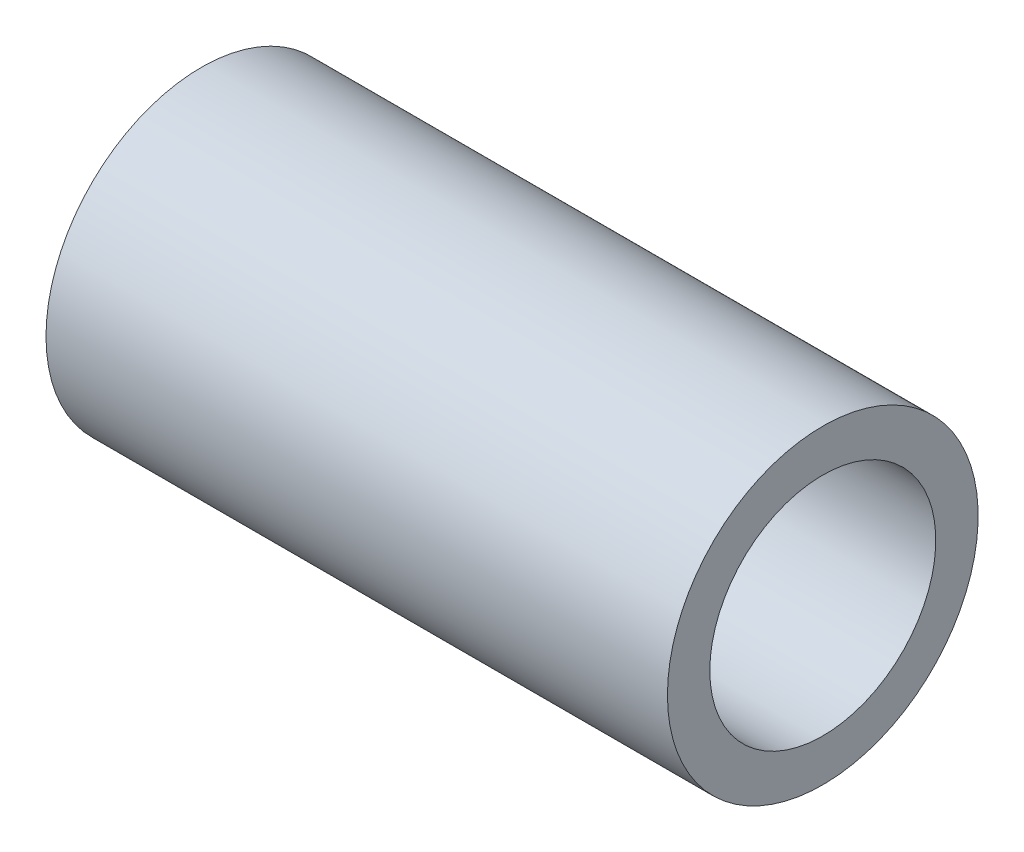
ISO-10303-21;
HEADER;
FILE_DESCRIPTION(('STEP AP214'),'2;1');
FILE_NAME('part.step','',(''),(''),'','','');
FILE_SCHEMA(('AUTOMOTIVE_DESIGN { 1 0 10303 214 1 1 1 1 }'));
ENDSEC;
DATA;
#1=APPLICATION_CONTEXT('core data for automotive mechanical design processes');
#2=APPLICATION_PROTOCOL_DEFINITION('international standard','automotive_design',2000,#1);
#3=PRODUCT_CONTEXT('',#1,'mechanical');
#4=PRODUCT('Part','Part','',(#3));
#5=PRODUCT_RELATED_PRODUCT_CATEGORY('part','',(#4));
#6=PRODUCT_DEFINITION_FORMATION('','',#4);
#7=PRODUCT_DEFINITION_CONTEXT('part definition',#1,'design');
#8=PRODUCT_DEFINITION('design','',#6,#7);
#9=PRODUCT_DEFINITION_SHAPE('','',#8);
#10=(LENGTH_UNIT() NAMED_UNIT(*) SI_UNIT(.MILLI.,.METRE.));
#11=(NAMED_UNIT(*) PLANE_ANGLE_UNIT() SI_UNIT($,.RADIAN.));
#12=(NAMED_UNIT(*) SI_UNIT($,.STERADIAN.) SOLID_ANGLE_UNIT());
#13=UNCERTAINTY_MEASURE_WITH_UNIT(LENGTH_MEASURE(1.E-05),#10,'distance_accuracy_value','');
#14=(GEOMETRIC_REPRESENTATION_CONTEXT(3) GLOBAL_UNCERTAINTY_ASSIGNED_CONTEXT((#13)) GLOBAL_UNIT_ASSIGNED_CONTEXT((#10,
#11,#12)) REPRESENTATION_CONTEXT('',''));
#15=CARTESIAN_POINT('',(0.,0.,0.));
#16=DIRECTION('',(0.,0.,1.));
#17=DIRECTION('',(1.,0.,0.));
#18=AXIS2_PLACEMENT_3D('',#15,#16,#17);
#19=CARTESIAN_POINT('',(0.,4.,0.));
#20=DIRECTION('',(1.,0.,0.));
#21=DIRECTION('',(0.,0.,-1.));
#22=AXIS2_PLACEMENT_3D('',#19,#20,#21);
#23=PLANE('',#22);
#24=CARTESIAN_POINT('',(0.,0.,0.));
#25=DIRECTION('',(-1.,0.,0.));
#26=DIRECTION('',(0.,0.,1.));
#27=AXIS2_PLACEMENT_3D('',#24,#25,#26);
#28=CIRCLE('',#27,4.);
#29=CARTESIAN_POINT('',(0.,0.,4.));
#30=VERTEX_POINT('',#29);
#31=EDGE_CURVE('E44',#30,#30,#28,.T.);
#32=ORIENTED_EDGE('',*,*,#31,.F.);
#33=EDGE_LOOP('',(#32));
#34=FACE_BOUND('',#33,.T.);
#35=CARTESIAN_POINT('',(0.,0.,0.));
#36=DIRECTION('',(-1.,0.,0.));
#37=DIRECTION('',(0.,0.,1.));
#38=AXIS2_PLACEMENT_3D('',#35,#36,#37);
#39=CIRCLE('',#38,5.5);
#40=CARTESIAN_POINT('',(0.,0.,5.5));
#41=VERTEX_POINT('',#40);
#42=EDGE_CURVE('E10',#41,#41,#39,.T.);
#43=ORIENTED_EDGE('',*,*,#42,.T.);
#44=EDGE_LOOP('',(#43));
#45=FACE_BOUND('',#44,.T.);
#46=ADVANCED_FACE('F30',(#34,#45),#23,.F.);
#47=CARTESIAN_POINT('',(0.,0.,0.));
#48=DIRECTION('',(-1.,0.,0.));
#49=DIRECTION('',(0.,0.,1.));
#50=AXIS2_PLACEMENT_3D('',#47,#48,#49);
#51=CYLINDRICAL_SURFACE('',#50,5.5);
#52=ORIENTED_EDGE('',*,*,#42,.F.);
#53=EDGE_LOOP('',(#52));
#54=FACE_BOUND('',#53,.T.);
#55=CARTESIAN_POINT('',(22.,0.,0.));
#56=DIRECTION('',(-1.,0.,0.));
#57=DIRECTION('',(0.,0.,1.));
#58=AXIS2_PLACEMENT_3D('',#55,#56,#57);
#59=CIRCLE('',#58,5.5);
#60=CARTESIAN_POINT('',(22.,0.,5.5));
#61=VERTEX_POINT('',#60);
#62=EDGE_CURVE('E36',#61,#61,#59,.T.);
#63=ORIENTED_EDGE('',*,*,#62,.T.);
#64=EDGE_LOOP('',(#63));
#65=FACE_BOUND('',#64,.T.);
#66=ADVANCED_FACE('F53',(#54,#65),#51,.T.);
#67=CARTESIAN_POINT('',(22.,4.,0.));
#68=DIRECTION('',(-1.,0.,0.));
#69=DIRECTION('',(0.,0.,1.));
#70=AXIS2_PLACEMENT_3D('',#67,#68,#69);
#71=PLANE('',#70);
#72=ORIENTED_EDGE('',*,*,#62,.F.);
#73=EDGE_LOOP('',(#72));
#74=FACE_BOUND('',#73,.T.);
#75=CARTESIAN_POINT('',(22.,0.,0.));
#76=DIRECTION('',(-1.,0.,0.));
#77=DIRECTION('',(0.,0.,1.));
#78=AXIS2_PLACEMENT_3D('',#75,#76,#77);
#79=CIRCLE('',#78,4.);
#80=CARTESIAN_POINT('',(22.,0.,4.));
#81=VERTEX_POINT('',#80);
#82=EDGE_CURVE('E40',#81,#81,#79,.T.);
#83=ORIENTED_EDGE('',*,*,#82,.T.);
#84=EDGE_LOOP('',(#83));
#85=FACE_BOUND('',#84,.T.);
#86=ADVANCED_FACE('F57',(#74,#85),#71,.F.);
#87=CARTESIAN_POINT('',(0.,0.,0.));
#88=DIRECTION('',(-1.,0.,0.));
#89=DIRECTION('',(0.,0.,1.));
#90=AXIS2_PLACEMENT_3D('',#87,#88,#89);
#91=CYLINDRICAL_SURFACE('',#90,4.);
#92=ORIENTED_EDGE('',*,*,#82,.F.);
#93=EDGE_LOOP('',(#92));
#94=FACE_BOUND('',#93,.T.);
#95=ORIENTED_EDGE('',*,*,#31,.T.);
#96=EDGE_LOOP('',(#95));
#97=FACE_BOUND('',#96,.T.);
#98=ADVANCED_FACE('F50',(#94,#97),#91,.F.);
#99=CLOSED_SHELL('',(#46,#66,#86,#98));
#100=MANIFOLD_SOLID_BREP('B2',#99);
#101=ADVANCED_BREP_SHAPE_REPRESENTATION('',(#18,#100),#14);
#102=SHAPE_DEFINITION_REPRESENTATION(#9,#101);
ENDSEC;
END-ISO-10303-21;
